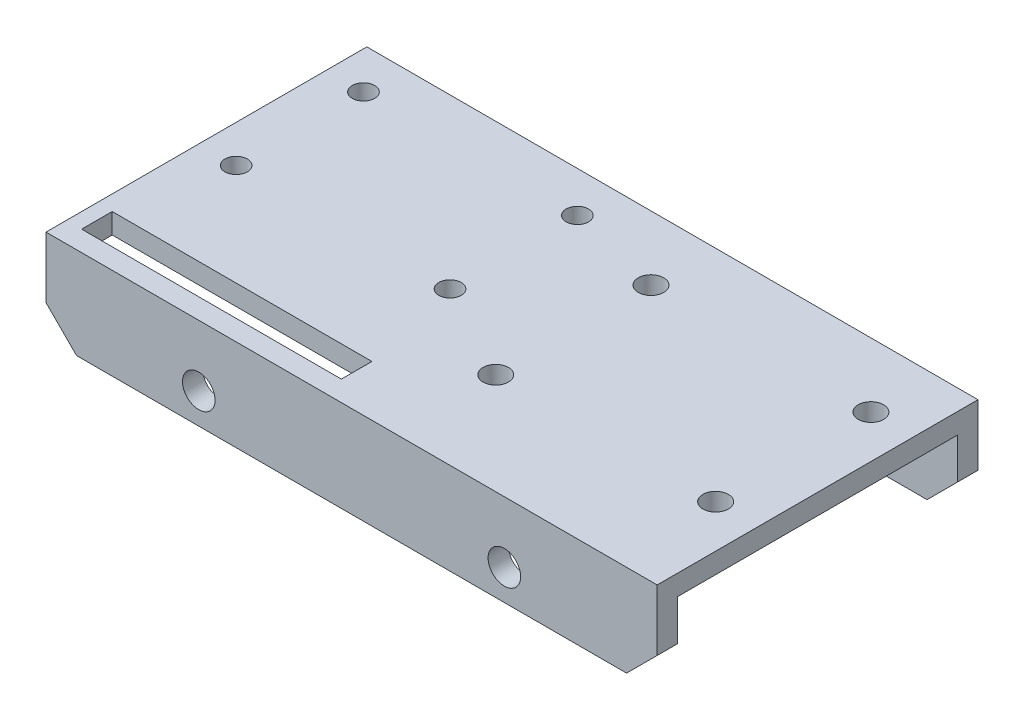
ISO-10303-21;
HEADER;
FILE_DESCRIPTION(('STEP AP214'),'2;1');
FILE_NAME('part.step','',(''),(''),'','','');
FILE_SCHEMA(('AUTOMOTIVE_DESIGN { 1 0 10303 214 1 1 1 1 }'));
ENDSEC;
DATA;
#1=APPLICATION_CONTEXT('core data for automotive mechanical design processes');
#2=APPLICATION_PROTOCOL_DEFINITION('international standard','automotive_design',2000,#1);
#3=PRODUCT_CONTEXT('',#1,'mechanical');
#4=PRODUCT('Part','Part','',(#3));
#5=PRODUCT_RELATED_PRODUCT_CATEGORY('part','',(#4));
#6=PRODUCT_DEFINITION_FORMATION('','',#4);
#7=PRODUCT_DEFINITION_CONTEXT('part definition',#1,'design');
#8=PRODUCT_DEFINITION('design','',#6,#7);
#9=PRODUCT_DEFINITION_SHAPE('','',#8);
#10=(LENGTH_UNIT() NAMED_UNIT(*) SI_UNIT(.MILLI.,.METRE.));
#11=(NAMED_UNIT(*) PLANE_ANGLE_UNIT() SI_UNIT($,.RADIAN.));
#12=(NAMED_UNIT(*) SI_UNIT($,.STERADIAN.) SOLID_ANGLE_UNIT());
#13=UNCERTAINTY_MEASURE_WITH_UNIT(LENGTH_MEASURE(1.E-05),#10,'distance_accuracy_value','');
#14=(GEOMETRIC_REPRESENTATION_CONTEXT(3) GLOBAL_UNCERTAINTY_ASSIGNED_CONTEXT((#13)) GLOBAL_UNIT_ASSIGNED_CONTEXT((#10,
#11,#12)) REPRESENTATION_CONTEXT('',''));
#15=CARTESIAN_POINT('',(0.,0.,0.));
#16=DIRECTION('',(0.,0.,1.));
#17=DIRECTION('',(1.,0.,0.));
#18=AXIS2_PLACEMENT_3D('',#15,#16,#17);
#19=CARTESIAN_POINT('',(0.,0.,0.));
#20=DIRECTION('',(0.,1.,0.));
#21=DIRECTION('',(0.,0.,1.));
#22=AXIS2_PLACEMENT_3D('',#19,#20,#21);
#23=PLANE('',#22);
#24=CARTESIAN_POINT('',(-26.335,0.,0.750000000000007));
#25=DIRECTION('',(0.,1.,0.));
#26=DIRECTION('',(0.,0.,1.));
#27=AXIS2_PLACEMENT_3D('',#24,#25,#26);
#28=CIRCLE('',#27,1.1);
#29=CARTESIAN_POINT('',(-26.335,0.,1.85000000000001));
#30=VERTEX_POINT('',#29);
#31=EDGE_CURVE('E216',#30,#30,#28,.T.);
#32=ORIENTED_EDGE('',*,*,#31,.T.);
#33=EDGE_LOOP('',(#32));
#34=FACE_BOUND('',#33,.T.);
#35=CARTESIAN_POINT('',(4.20500000000002,0.,-9.43900000000005));
#36=DIRECTION('',(0.,1.,0.));
#37=DIRECTION('',(0.,0.,1.));
#38=AXIS2_PLACEMENT_3D('',#35,#36,#37);
#39=CIRCLE('',#38,1.25);
#40=CARTESIAN_POINT('',(4.20500000000002,0.,-8.18900000000005));
#41=VERTEX_POINT('',#40);
#42=EDGE_CURVE('E213',#41,#41,#39,.T.);
#43=ORIENTED_EDGE('',*,*,#42,.T.);
#44=EDGE_LOOP('',(#43));
#45=FACE_BOUND('',#44,.T.);
#46=CARTESIAN_POINT('',(25.795,0.,-9.43900000000004));
#47=DIRECTION('',(0.,1.,0.));
#48=DIRECTION('',(0.,0.,1.));
#49=AXIS2_PLACEMENT_3D('',#46,#47,#48);
#50=CIRCLE('',#49,1.25);
#51=CARTESIAN_POINT('',(25.795,0.,-8.18900000000004));
#52=VERTEX_POINT('',#51);
#53=EDGE_CURVE('E210',#52,#52,#50,.T.);
#54=ORIENTED_EDGE('',*,*,#53,.T.);
#55=EDGE_LOOP('',(#54));
#56=FACE_BOUND('',#55,.T.);
#57=CARTESIAN_POINT('',(4.20500000000002,0.,5.80099999999995));
#58=DIRECTION('',(0.,1.,0.));
#59=DIRECTION('',(0.,0.,1.));
#60=AXIS2_PLACEMENT_3D('',#57,#58,#59);
#61=CIRCLE('',#60,1.25);
#62=CARTESIAN_POINT('',(4.20500000000002,0.,7.05099999999995));
#63=VERTEX_POINT('',#62);
#64=EDGE_CURVE('E207',#63,#63,#61,.T.);
#65=ORIENTED_EDGE('',*,*,#64,.T.);
#66=EDGE_LOOP('',(#65));
#67=FACE_BOUND('',#66,.T.);
#68=CARTESIAN_POINT('',(-5.33499999999998,0.,-11.75));
#69=DIRECTION('',(0.,1.,0.));
#70=DIRECTION('',(0.,0.,1.));
#71=AXIS2_PLACEMENT_3D('',#68,#69,#70);
#72=CIRCLE('',#71,1.1);
#73=CARTESIAN_POINT('',(-5.33499999999998,0.,-10.65));
#74=VERTEX_POINT('',#73);
#75=EDGE_CURVE('E204',#74,#74,#72,.T.);
#76=ORIENTED_EDGE('',*,*,#75,.T.);
#77=EDGE_LOOP('',(#76));
#78=FACE_BOUND('',#77,.T.);
#79=CARTESIAN_POINT('',(-5.33499999999998,0.,0.750000000000016));
#80=DIRECTION('',(0.,1.,0.));
#81=DIRECTION('',(0.,0.,1.));
#82=AXIS2_PLACEMENT_3D('',#79,#80,#81);
#83=CIRCLE('',#82,1.1);
#84=CARTESIAN_POINT('',(-5.33499999999998,0.,1.85000000000002));
#85=VERTEX_POINT('',#84);
#86=EDGE_CURVE('E201',#85,#85,#83,.T.);
#87=ORIENTED_EDGE('',*,*,#86,.T.);
#88=EDGE_LOOP('',(#87));
#89=FACE_BOUND('',#88,.T.);
#90=CARTESIAN_POINT('',(-26.335,0.,-11.75));
#91=DIRECTION('',(0.,1.,0.));
#92=DIRECTION('',(0.,0.,1.));
#93=AXIS2_PLACEMENT_3D('',#90,#91,#92);
#94=CIRCLE('',#93,1.1);
#95=CARTESIAN_POINT('',(-26.335,0.,-10.65));
#96=VERTEX_POINT('',#95);
#97=EDGE_CURVE('E198',#96,#96,#94,.T.);
#98=ORIENTED_EDGE('',*,*,#97,.T.);
#99=EDGE_LOOP('',(#98));
#100=FACE_BOUND('',#99,.T.);
#101=CARTESIAN_POINT('',(25.795,0.,5.80099999999996));
#102=DIRECTION('',(0.,1.,0.));
#103=DIRECTION('',(0.,0.,1.));
#104=AXIS2_PLACEMENT_3D('',#101,#102,#103);
#105=CIRCLE('',#104,1.25);
#106=CARTESIAN_POINT('',(25.795,0.,7.05099999999996));
#107=VERTEX_POINT('',#106);
#108=EDGE_CURVE('E195',#107,#107,#105,.T.);
#109=ORIENTED_EDGE('',*,*,#108,.T.);
#110=EDGE_LOOP('',(#109));
#111=FACE_BOUND('',#110,.T.);
#112=DIRECTION('',(1.,0.,0.));
#113=VECTOR('',#112,1.);
#114=CARTESIAN_POINT('',(-28.5,0.,10.75));
#115=LINE('',#114,#113);
#116=CARTESIAN_POINT('',(-28.5,0.,10.75));
#117=VERTEX_POINT('',#116);
#118=CARTESIAN_POINT('',(-3.,0.,10.75));
#119=VERTEX_POINT('',#118);
#120=EDGE_CURVE('E148',#117,#119,#115,.T.);
#121=ORIENTED_EDGE('',*,*,#120,.F.);
#122=DIRECTION('',(0.,0.,-1.));
#123=VECTOR('',#122,1.);
#124=CARTESIAN_POINT('',(-28.5,0.,13.75));
#125=LINE('',#124,#123);
#126=CARTESIAN_POINT('',(-28.5,0.,13.75));
#127=VERTEX_POINT('',#126);
#128=EDGE_CURVE('E155',#127,#117,#125,.T.);
#129=ORIENTED_EDGE('',*,*,#128,.F.);
#130=DIRECTION('',(1.,0.,0.));
#131=VECTOR('',#130,1.);
#132=CARTESIAN_POINT('',(30.,0.,13.75));
#133=LINE('',#132,#131);
#134=CARTESIAN_POINT('',(-30.,0.,13.75));
#135=VERTEX_POINT('',#134);
#136=EDGE_CURVE('E244',#135,#127,#133,.T.);
#137=ORIENTED_EDGE('',*,*,#136,.F.);
#138=DIRECTION('',(0.,0.,1.));
#139=VECTOR('',#138,1.);
#140=CARTESIAN_POINT('',(-30.,0.,-15.75));
#141=LINE('',#140,#139);
#142=CARTESIAN_POINT('',(-30.,0.,-13.75));
#143=VERTEX_POINT('',#142);
#144=EDGE_CURVE('E271',#143,#135,#141,.T.);
#145=ORIENTED_EDGE('',*,*,#144,.F.);
#146=DIRECTION('',(-1.,0.,0.));
#147=VECTOR('',#146,1.);
#148=CARTESIAN_POINT('',(30.,0.,-13.75));
#149=LINE('',#148,#147);
#150=CARTESIAN_POINT('',(30.,0.,-13.75));
#151=VERTEX_POINT('',#150);
#152=EDGE_CURVE('E253',#151,#143,#149,.T.);
#153=ORIENTED_EDGE('',*,*,#152,.F.);
#154=DIRECTION('',(0.,0.,-1.));
#155=VECTOR('',#154,1.);
#156=CARTESIAN_POINT('',(30.,0.,-15.75));
#157=LINE('',#156,#155);
#158=CARTESIAN_POINT('',(30.,0.,13.75));
#159=VERTEX_POINT('',#158);
#160=EDGE_CURVE('E266',#159,#151,#157,.T.);
#161=ORIENTED_EDGE('',*,*,#160,.F.);
#162=CARTESIAN_POINT('',(-3.,0.,13.75));
#163=VERTEX_POINT('',#162);
#164=EDGE_CURVE('E239',#163,#159,#133,.T.);
#165=ORIENTED_EDGE('',*,*,#164,.F.);
#166=DIRECTION('',(0.,0.,1.));
#167=VECTOR('',#166,1.);
#168=CARTESIAN_POINT('',(-3.,0.,13.75));
#169=LINE('',#168,#167);
#170=EDGE_CURVE('E55',#119,#163,#169,.T.);
#171=ORIENTED_EDGE('',*,*,#170,.F.);
#172=EDGE_LOOP('',(#121,#129,#137,#145,#153,#161,#165,#171));
#173=FACE_BOUND('',#172,.T.);
#174=ADVANCED_FACE('F33',(#34,#45,#56,#67,#78,#89,#100,#111,#173),#23,.F.);
#175=CARTESIAN_POINT('',(30.,2.,-15.75));
#176=DIRECTION('',(-1.,0.,0.));
#177=DIRECTION('',(0.,0.,1.));
#178=AXIS2_PLACEMENT_3D('',#175,#176,#177);
#179=PLANE('',#178);
#180=DIRECTION('',(0.,-1.,0.));
#181=VECTOR('',#180,1.);
#182=CARTESIAN_POINT('',(30.,2.,15.75));
#183=LINE('',#182,#181);
#184=CARTESIAN_POINT('',(30.,2.,15.75));
#185=VERTEX_POINT('',#184);
#186=CARTESIAN_POINT('',(30.,-3.99999999999998,15.75));
#187=VERTEX_POINT('',#186);
#188=EDGE_CURVE('E277',#185,#187,#183,.T.);
#189=ORIENTED_EDGE('',*,*,#188,.T.);
#190=DIRECTION('',(0.,0.,-1.));
#191=VECTOR('',#190,1.);
#192=CARTESIAN_POINT('',(30.,-3.99999999999998,-15.75));
#193=LINE('',#192,#191);
#194=CARTESIAN_POINT('',(30.,-3.99999999999998,13.75));
#195=VERTEX_POINT('',#194);
#196=EDGE_CURVE('E325',#187,#195,#193,.T.);
#197=ORIENTED_EDGE('',*,*,#196,.T.);
#198=DIRECTION('',(0.,1.,0.));
#199=VECTOR('',#198,1.);
#200=CARTESIAN_POINT('',(30.,-7.,13.75));
#201=LINE('',#200,#199);
#202=EDGE_CURVE('E247',#195,#159,#201,.T.);
#203=ORIENTED_EDGE('',*,*,#202,.T.);
#204=ORIENTED_EDGE('',*,*,#160,.T.);
#205=DIRECTION('',(0.,1.,0.));
#206=VECTOR('',#205,1.);
#207=CARTESIAN_POINT('',(30.,-7.,-13.75));
#208=LINE('',#207,#206);
#209=CARTESIAN_POINT('',(30.,-4.,-13.75));
#210=VERTEX_POINT('',#209);
#211=EDGE_CURVE('E264',#210,#151,#208,.T.);
#212=ORIENTED_EDGE('',*,*,#211,.F.);
#213=DIRECTION('',(0.,0.,-1.));
#214=VECTOR('',#213,1.);
#215=CARTESIAN_POINT('',(30.,-4.,-15.75));
#216=LINE('',#215,#214);
#217=CARTESIAN_POINT('',(30.,-4.,-15.75));
#218=VERTEX_POINT('',#217);
#219=EDGE_CURVE('E313',#210,#218,#216,.T.);
#220=ORIENTED_EDGE('',*,*,#219,.T.);
#221=DIRECTION('',(0.,-1.,0.));
#222=VECTOR('',#221,1.);
#223=CARTESIAN_POINT('',(30.,2.,-15.75));
#224=LINE('',#223,#222);
#225=CARTESIAN_POINT('',(30.,2.,-15.75));
#226=VERTEX_POINT('',#225);
#227=EDGE_CURVE('E290',#226,#218,#224,.T.);
#228=ORIENTED_EDGE('',*,*,#227,.F.);
#229=DIRECTION('',(0.,0.,-1.));
#230=VECTOR('',#229,1.);
#231=CARTESIAN_POINT('',(30.,2.,-15.75));
#232=LINE('',#231,#230);
#233=EDGE_CURVE('E267',#185,#226,#232,.T.);
#234=ORIENTED_EDGE('',*,*,#233,.F.);
#235=EDGE_LOOP('',(#189,#197,#203,#204,#212,#220,#228,#234));
#236=FACE_BOUND('',#235,.T.);
#237=ADVANCED_FACE('F370',(#236),#179,.F.);
#238=CARTESIAN_POINT('',(-30.,2.,-15.75));
#239=DIRECTION('',(0.,0.,1.));
#240=DIRECTION('',(1.,0.,0.));
#241=AXIS2_PLACEMENT_3D('',#238,#239,#240);
#242=PLANE('',#241);
#243=CARTESIAN_POINT('',(-15.,-3.99999999999999,-15.75));
#244=DIRECTION('',(0.,0.,1.));
#245=DIRECTION('',(1.,0.,0.));
#246=AXIS2_PLACEMENT_3D('',#243,#244,#245);
#247=CIRCLE('',#246,1.60000000000001);
#248=CARTESIAN_POINT('',(-13.4,-3.99999999999999,-15.75));
#249=VERTEX_POINT('',#248);
#250=EDGE_CURVE('E236',#249,#249,#247,.T.);
#251=ORIENTED_EDGE('',*,*,#250,.T.);
#252=EDGE_LOOP('',(#251));
#253=FACE_BOUND('',#252,.T.);
#254=CARTESIAN_POINT('',(15.,-3.99999999999999,-15.75));
#255=DIRECTION('',(0.,0.,1.));
#256=DIRECTION('',(1.,0.,0.));
#257=AXIS2_PLACEMENT_3D('',#254,#255,#256);
#258=CIRCLE('',#257,1.6);
#259=CARTESIAN_POINT('',(16.6,-3.99999999999999,-15.75));
#260=VERTEX_POINT('',#259);
#261=EDGE_CURVE('E229',#260,#260,#258,.T.);
#262=ORIENTED_EDGE('',*,*,#261,.T.);
#263=EDGE_LOOP('',(#262));
#264=FACE_BOUND('',#263,.T.);
#265=DIRECTION('',(1.,0.,0.));
#266=VECTOR('',#265,1.);
#267=CARTESIAN_POINT('',(30.,-7.,-15.75));
#268=LINE('',#267,#266);
#269=CARTESIAN_POINT('',(-27.,-7.,-15.75));
#270=VERTEX_POINT('',#269);
#271=CARTESIAN_POINT('',(27.,-7.,-15.75));
#272=VERTEX_POINT('',#271);
#273=EDGE_CURVE('E257',#270,#272,#268,.T.);
#274=ORIENTED_EDGE('',*,*,#273,.F.);
#275=DIRECTION('',(-0.707106781186547,0.707106781186549,0.));
#276=VECTOR('',#275,1.);
#277=CARTESIAN_POINT('',(-27.,-7.,-15.75));
#278=LINE('',#277,#276);
#279=CARTESIAN_POINT('',(-30.,-4.,-15.75));
#280=VERTEX_POINT('',#279);
#281=EDGE_CURVE('E305',#270,#280,#278,.T.);
#282=ORIENTED_EDGE('',*,*,#281,.T.);
#283=DIRECTION('',(0.,-1.,0.));
#284=VECTOR('',#283,1.);
#285=CARTESIAN_POINT('',(-30.,2.,-15.75));
#286=LINE('',#285,#284);
#287=CARTESIAN_POINT('',(-30.,2.,-15.75));
#288=VERTEX_POINT('',#287);
#289=EDGE_CURVE('E287',#288,#280,#286,.T.);
#290=ORIENTED_EDGE('',*,*,#289,.F.);
#291=DIRECTION('',(-1.,0.,0.));
#292=VECTOR('',#291,1.);
#293=CARTESIAN_POINT('',(-30.,2.,-15.75));
#294=LINE('',#293,#292);
#295=EDGE_CURVE('E270',#226,#288,#294,.T.);
#296=ORIENTED_EDGE('',*,*,#295,.F.);
#297=ORIENTED_EDGE('',*,*,#227,.T.);
#298=DIRECTION('',(-0.707106781186547,-0.707106781186548,0.));
#299=VECTOR('',#298,1.);
#300=CARTESIAN_POINT('',(27.,-7.,-15.75));
#301=LINE('',#300,#299);
#302=EDGE_CURVE('E303',#218,#272,#301,.T.);
#303=ORIENTED_EDGE('',*,*,#302,.T.);
#304=EDGE_LOOP('',(#274,#282,#290,#296,#297,#303));
#305=FACE_BOUND('',#304,.T.);
#306=ADVANCED_FACE('F376',(#253,#264,#305),#242,.F.);
#307=CARTESIAN_POINT('',(-30.,2.,-15.75));
#308=DIRECTION('',(1.,0.,0.));
#309=DIRECTION('',(0.,0.,-1.));
#310=AXIS2_PLACEMENT_3D('',#307,#308,#309);
#311=PLANE('',#310);
#312=DIRECTION('',(0.,1.,0.));
#313=VECTOR('',#312,1.);
#314=CARTESIAN_POINT('',(-30.,-7.,13.75));
#315=LINE('',#314,#313);
#316=CARTESIAN_POINT('',(-30.,-4.,13.75));
#317=VERTEX_POINT('',#316);
#318=EDGE_CURVE('E251',#317,#135,#315,.T.);
#319=ORIENTED_EDGE('',*,*,#318,.F.);
#320=DIRECTION('',(0.,0.,1.));
#321=VECTOR('',#320,1.);
#322=CARTESIAN_POINT('',(-30.,-4.,-15.75));
#323=LINE('',#322,#321);
#324=CARTESIAN_POINT('',(-30.,-4.,15.75));
#325=VERTEX_POINT('',#324);
#326=EDGE_CURVE('E331',#317,#325,#323,.T.);
#327=ORIENTED_EDGE('',*,*,#326,.T.);
#328=DIRECTION('',(0.,-1.,0.));
#329=VECTOR('',#328,1.);
#330=CARTESIAN_POINT('',(-30.,2.,15.75));
#331=LINE('',#330,#329);
#332=CARTESIAN_POINT('',(-30.,2.,15.75));
#333=VERTEX_POINT('',#332);
#334=EDGE_CURVE('E284',#333,#325,#331,.T.);
#335=ORIENTED_EDGE('',*,*,#334,.F.);
#336=DIRECTION('',(0.,0.,1.));
#337=VECTOR('',#336,1.);
#338=CARTESIAN_POINT('',(-30.,2.,-15.75));
#339=LINE('',#338,#337);
#340=EDGE_CURVE('E273',#288,#333,#339,.T.);
#341=ORIENTED_EDGE('',*,*,#340,.F.);
#342=ORIENTED_EDGE('',*,*,#289,.T.);
#343=DIRECTION('',(0.,0.,1.));
#344=VECTOR('',#343,1.);
#345=CARTESIAN_POINT('',(-30.,-4.,-13.75));
#346=LINE('',#345,#344);
#347=CARTESIAN_POINT('',(-30.,-4.,-13.75));
#348=VERTEX_POINT('',#347);
#349=EDGE_CURVE('E307',#280,#348,#346,.T.);
#350=ORIENTED_EDGE('',*,*,#349,.T.);
#351=DIRECTION('',(0.,1.,0.));
#352=VECTOR('',#351,1.);
#353=CARTESIAN_POINT('',(-30.,-7.,-13.75));
#354=LINE('',#353,#352);
#355=EDGE_CURVE('E260',#348,#143,#354,.T.);
#356=ORIENTED_EDGE('',*,*,#355,.T.);
#357=ORIENTED_EDGE('',*,*,#144,.T.);
#358=EDGE_LOOP('',(#319,#327,#335,#341,#342,#350,#356,#357));
#359=FACE_BOUND('',#358,.T.);
#360=ADVANCED_FACE('F393',(#359),#311,.F.);
#361=CARTESIAN_POINT('',(-30.,2.,15.75));
#362=DIRECTION('',(0.,0.,-1.));
#363=DIRECTION('',(-1.,0.,0.));
#364=AXIS2_PLACEMENT_3D('',#361,#362,#363);
#365=PLANE('',#364);
#366=CARTESIAN_POINT('',(-15.,-3.99999999999999,15.75));
#367=DIRECTION('',(0.,0.,-1.));
#368=DIRECTION('',(-1.,0.,0.));
#369=AXIS2_PLACEMENT_3D('',#366,#367,#368);
#370=CIRCLE('',#369,1.60000000000001);
#371=CARTESIAN_POINT('',(-16.6,-3.99999999999999,15.75));
#372=VERTEX_POINT('',#371);
#373=EDGE_CURVE('E220',#372,#372,#370,.T.);
#374=ORIENTED_EDGE('',*,*,#373,.T.);
#375=EDGE_LOOP('',(#374));
#376=FACE_BOUND('',#375,.T.);
#377=CARTESIAN_POINT('',(15.,-3.99999999999999,15.75));
#378=DIRECTION('',(0.,0.,-1.));
#379=DIRECTION('',(1.,0.,0.));
#380=AXIS2_PLACEMENT_3D('',#377,#378,#379);
#381=CIRCLE('',#380,1.6);
#382=CARTESIAN_POINT('',(16.6,-3.99999999999999,15.75));
#383=VERTEX_POINT('',#382);
#384=EDGE_CURVE('E219',#383,#383,#381,.T.);
#385=ORIENTED_EDGE('',*,*,#384,.T.);
#386=EDGE_LOOP('',(#385));
#387=FACE_BOUND('',#386,.T.);
#388=DIRECTION('',(-1.,0.,0.));
#389=VECTOR('',#388,1.);
#390=CARTESIAN_POINT('',(30.,-7.,15.75));
#391=LINE('',#390,#389);
#392=CARTESIAN_POINT('',(27.,-7.,15.75));
#393=VERTEX_POINT('',#392);
#394=CARTESIAN_POINT('',(-27.,-7.,15.75));
#395=VERTEX_POINT('',#394);
#396=EDGE_CURVE('E240',#393,#395,#391,.T.);
#397=ORIENTED_EDGE('',*,*,#396,.F.);
#398=DIRECTION('',(-0.707106781186547,-0.707106781186548,0.));
#399=VECTOR('',#398,1.);
#400=CARTESIAN_POINT('',(27.,-7.,15.75));
#401=LINE('',#400,#399);
#402=EDGE_CURVE('E323',#393,#187,#401,.F.);
#403=ORIENTED_EDGE('',*,*,#402,.T.);
#404=ORIENTED_EDGE('',*,*,#188,.F.);
#405=DIRECTION('',(1.,0.,0.));
#406=VECTOR('',#405,1.);
#407=CARTESIAN_POINT('',(-30.,2.,15.75));
#408=LINE('',#407,#406);
#409=EDGE_CURVE('E275',#333,#185,#408,.T.);
#410=ORIENTED_EDGE('',*,*,#409,.F.);
#411=ORIENTED_EDGE('',*,*,#334,.T.);
#412=DIRECTION('',(-0.707106781186547,0.707106781186549,0.));
#413=VECTOR('',#412,1.);
#414=CARTESIAN_POINT('',(-27.,-7.,15.75));
#415=LINE('',#414,#413);
#416=EDGE_CURVE('E321',#325,#395,#415,.F.);
#417=ORIENTED_EDGE('',*,*,#416,.T.);
#418=EDGE_LOOP('',(#397,#403,#404,#410,#411,#417));
#419=FACE_BOUND('',#418,.T.);
#420=ADVANCED_FACE('F346',(#376,#387,#419),#365,.F.);
#421=CARTESIAN_POINT('',(0.,2.,0.));
#422=DIRECTION('',(0.,1.,0.));
#423=DIRECTION('',(0.,0.,1.));
#424=AXIS2_PLACEMENT_3D('',#421,#422,#423);
#425=PLANE('',#424);
#426=DIRECTION('',(0.,0.,1.));
#427=VECTOR('',#426,1.);
#428=CARTESIAN_POINT('',(-28.5,2.,0.));
#429=LINE('',#428,#427);
#430=CARTESIAN_POINT('',(-28.5,2.,10.75));
#431=VERTEX_POINT('',#430);
#432=CARTESIAN_POINT('',(-28.5,2.,13.75));
#433=VERTEX_POINT('',#432);
#434=EDGE_CURVE('E11',#431,#433,#429,.T.);
#435=ORIENTED_EDGE('',*,*,#434,.F.);
#436=DIRECTION('',(-1.,0.,0.));
#437=VECTOR('',#436,1.);
#438=CARTESIAN_POINT('',(0.,2.,10.75));
#439=LINE('',#438,#437);
#440=CARTESIAN_POINT('',(-3.,2.,10.75));
#441=VERTEX_POINT('',#440);
#442=EDGE_CURVE('E150',#441,#431,#439,.T.);
#443=ORIENTED_EDGE('',*,*,#442,.F.);
#444=DIRECTION('',(0.,0.,-1.));
#445=VECTOR('',#444,1.);
#446=CARTESIAN_POINT('',(-3.,2.,0.));
#447=LINE('',#446,#445);
#448=CARTESIAN_POINT('',(-3.,2.,13.75));
#449=VERTEX_POINT('',#448);
#450=EDGE_CURVE('E334',#449,#441,#447,.T.);
#451=ORIENTED_EDGE('',*,*,#450,.F.);
#452=DIRECTION('',(1.,0.,0.));
#453=VECTOR('',#452,1.);
#454=CARTESIAN_POINT('',(0.,2.,13.75));
#455=LINE('',#454,#453);
#456=EDGE_CURVE('E41',#433,#449,#455,.T.);
#457=ORIENTED_EDGE('',*,*,#456,.F.);
#458=EDGE_LOOP('',(#435,#443,#451,#457));
#459=FACE_BOUND('',#458,.T.);
#460=CARTESIAN_POINT('',(-26.335,2.,0.750000000000007));
#461=DIRECTION('',(0.,1.,0.));
#462=DIRECTION('',(0.,0.,1.));
#463=AXIS2_PLACEMENT_3D('',#460,#461,#462);
#464=CIRCLE('',#463,1.1);
#465=CARTESIAN_POINT('',(-26.335,2.,1.85000000000001));
#466=VERTEX_POINT('',#465);
#467=EDGE_CURVE('E178',#466,#466,#464,.T.);
#468=ORIENTED_EDGE('',*,*,#467,.F.);
#469=EDGE_LOOP('',(#468));
#470=FACE_BOUND('',#469,.T.);
#471=CARTESIAN_POINT('',(4.20500000000002,2.,-9.43900000000005));
#472=DIRECTION('',(0.,1.,0.));
#473=DIRECTION('',(0.,0.,1.));
#474=AXIS2_PLACEMENT_3D('',#471,#472,#473);
#475=CIRCLE('',#474,1.25);
#476=CARTESIAN_POINT('',(4.20500000000002,2.,-8.18900000000005));
#477=VERTEX_POINT('',#476);
#478=EDGE_CURVE('E181',#477,#477,#475,.T.);
#479=ORIENTED_EDGE('',*,*,#478,.F.);
#480=EDGE_LOOP('',(#479));
#481=FACE_BOUND('',#480,.T.);
#482=CARTESIAN_POINT('',(25.795,2.,-9.43900000000004));
#483=DIRECTION('',(0.,1.,0.));
#484=DIRECTION('',(0.,0.,1.));
#485=AXIS2_PLACEMENT_3D('',#482,#483,#484);
#486=CIRCLE('',#485,1.25);
#487=CARTESIAN_POINT('',(25.795,2.,-8.18900000000004));
#488=VERTEX_POINT('',#487);
#489=EDGE_CURVE('E184',#488,#488,#486,.T.);
#490=ORIENTED_EDGE('',*,*,#489,.F.);
#491=EDGE_LOOP('',(#490));
#492=FACE_BOUND('',#491,.T.);
#493=CARTESIAN_POINT('',(4.20500000000002,2.,5.80099999999995));
#494=DIRECTION('',(0.,1.,0.));
#495=DIRECTION('',(0.,0.,1.));
#496=AXIS2_PLACEMENT_3D('',#493,#494,#495);
#497=CIRCLE('',#496,1.25);
#498=CARTESIAN_POINT('',(4.20500000000002,2.,7.05099999999995));
#499=VERTEX_POINT('',#498);
#500=EDGE_CURVE('E187',#499,#499,#497,.T.);
#501=ORIENTED_EDGE('',*,*,#500,.F.);
#502=EDGE_LOOP('',(#501));
#503=FACE_BOUND('',#502,.T.);
#504=CARTESIAN_POINT('',(-5.33499999999998,2.,-11.75));
#505=DIRECTION('',(0.,1.,0.));
#506=DIRECTION('',(0.,0.,1.));
#507=AXIS2_PLACEMENT_3D('',#504,#505,#506);
#508=CIRCLE('',#507,1.1);
#509=CARTESIAN_POINT('',(-5.33499999999998,2.,-10.65));
#510=VERTEX_POINT('',#509);
#511=EDGE_CURVE('E168',#510,#510,#508,.T.);
#512=ORIENTED_EDGE('',*,*,#511,.F.);
#513=EDGE_LOOP('',(#512));
#514=FACE_BOUND('',#513,.T.);
#515=CARTESIAN_POINT('',(-5.33499999999998,2.,0.750000000000016));
#516=DIRECTION('',(0.,1.,0.));
#517=DIRECTION('',(0.,0.,1.));
#518=AXIS2_PLACEMENT_3D('',#515,#516,#517);
#519=CIRCLE('',#518,1.1);
#520=CARTESIAN_POINT('',(-5.33499999999998,2.,1.85000000000002));
#521=VERTEX_POINT('',#520);
#522=EDGE_CURVE('E174',#521,#521,#519,.T.);
#523=ORIENTED_EDGE('',*,*,#522,.F.);
#524=EDGE_LOOP('',(#523));
#525=FACE_BOUND('',#524,.T.);
#526=CARTESIAN_POINT('',(-26.335,2.,-11.75));
#527=DIRECTION('',(0.,1.,0.));
#528=DIRECTION('',(0.,0.,1.));
#529=AXIS2_PLACEMENT_3D('',#526,#527,#528);
#530=CIRCLE('',#529,1.1);
#531=CARTESIAN_POINT('',(-26.335,2.,-10.65));
#532=VERTEX_POINT('',#531);
#533=EDGE_CURVE('E175',#532,#532,#530,.T.);
#534=ORIENTED_EDGE('',*,*,#533,.F.);
#535=EDGE_LOOP('',(#534));
#536=FACE_BOUND('',#535,.T.);
#537=CARTESIAN_POINT('',(25.795,2.,5.80099999999996));
#538=DIRECTION('',(0.,1.,0.));
#539=DIRECTION('',(0.,0.,1.));
#540=AXIS2_PLACEMENT_3D('',#537,#538,#539);
#541=CIRCLE('',#540,1.25);
#542=CARTESIAN_POINT('',(25.795,2.,7.05099999999996));
#543=VERTEX_POINT('',#542);
#544=EDGE_CURVE('E190',#543,#543,#541,.T.);
#545=ORIENTED_EDGE('',*,*,#544,.F.);
#546=EDGE_LOOP('',(#545));
#547=FACE_BOUND('',#546,.T.);
#548=ORIENTED_EDGE('',*,*,#233,.T.);
#549=ORIENTED_EDGE('',*,*,#295,.T.);
#550=ORIENTED_EDGE('',*,*,#340,.T.);
#551=ORIENTED_EDGE('',*,*,#409,.T.);
#552=EDGE_LOOP('',(#548,#549,#550,#551));
#553=FACE_BOUND('',#552,.T.);
#554=ADVANCED_FACE('F342',(#459,#470,#481,#492,#503,#514,#525,#536,#547,#553),#425,.T.);
#555=CARTESIAN_POINT('',(30.,-7.,-13.75));
#556=DIRECTION('',(0.,0.,-1.));
#557=DIRECTION('',(-1.,0.,0.));
#558=AXIS2_PLACEMENT_3D('',#555,#556,#557);
#559=PLANE('',#558);
#560=CARTESIAN_POINT('',(-15.,-3.99999999999999,-13.75));
#561=DIRECTION('',(0.,0.,-1.));
#562=DIRECTION('',(-1.,0.,0.));
#563=AXIS2_PLACEMENT_3D('',#560,#561,#562);
#564=CIRCLE('',#563,1.60000000000001);
#565=CARTESIAN_POINT('',(-16.6,-3.99999999999999,-13.75));
#566=VERTEX_POINT('',#565);
#567=EDGE_CURVE('E233',#566,#566,#564,.T.);
#568=ORIENTED_EDGE('',*,*,#567,.T.);
#569=EDGE_LOOP('',(#568));
#570=FACE_BOUND('',#569,.T.);
#571=CARTESIAN_POINT('',(15.,-3.99999999999999,-13.75));
#572=DIRECTION('',(0.,0.,-1.));
#573=DIRECTION('',(-1.,0.,0.));
#574=AXIS2_PLACEMENT_3D('',#571,#572,#573);
#575=CIRCLE('',#574,1.6);
#576=CARTESIAN_POINT('',(13.4,-3.99999999999999,-13.75));
#577=VERTEX_POINT('',#576);
#578=EDGE_CURVE('E226',#577,#577,#575,.T.);
#579=ORIENTED_EDGE('',*,*,#578,.T.);
#580=EDGE_LOOP('',(#579));
#581=FACE_BOUND('',#580,.T.);
#582=ORIENTED_EDGE('',*,*,#355,.F.);
#583=DIRECTION('',(0.707106781186547,-0.707106781186549,0.));
#584=VECTOR('',#583,1.);
#585=CARTESIAN_POINT('',(-27.,-7.,-13.75));
#586=LINE('',#585,#584);
#587=CARTESIAN_POINT('',(-27.,-7.,-13.75));
#588=VERTEX_POINT('',#587);
#589=EDGE_CURVE('E311',#348,#588,#586,.T.);
#590=ORIENTED_EDGE('',*,*,#589,.T.);
#591=DIRECTION('',(-1.,0.,0.));
#592=VECTOR('',#591,1.);
#593=CARTESIAN_POINT('',(30.,-7.,-13.75));
#594=LINE('',#593,#592);
#595=CARTESIAN_POINT('',(27.,-7.,-13.75));
#596=VERTEX_POINT('',#595);
#597=EDGE_CURVE('E254',#596,#588,#594,.T.);
#598=ORIENTED_EDGE('',*,*,#597,.F.);
#599=DIRECTION('',(0.707106781186547,0.707106781186548,0.));
#600=VECTOR('',#599,1.);
#601=CARTESIAN_POINT('',(27.,-7.,-13.75));
#602=LINE('',#601,#600);
#603=EDGE_CURVE('E309',#596,#210,#602,.T.);
#604=ORIENTED_EDGE('',*,*,#603,.T.);
#605=ORIENTED_EDGE('',*,*,#211,.T.);
#606=ORIENTED_EDGE('',*,*,#152,.T.);
#607=EDGE_LOOP('',(#582,#590,#598,#604,#605,#606));
#608=FACE_BOUND('',#607,.T.);
#609=ADVANCED_FACE('F345',(#570,#581,#608),#559,.F.);
#610=CARTESIAN_POINT('',(0.,-7.,0.));
#611=DIRECTION('',(0.,-1.,0.));
#612=DIRECTION('',(0.,0.,-1.));
#613=AXIS2_PLACEMENT_3D('',#610,#611,#612);
#614=PLANE('',#613);
#615=ORIENTED_EDGE('',*,*,#597,.T.);
#616=DIRECTION('',(0.,0.,-1.));
#617=VECTOR('',#616,1.);
#618=CARTESIAN_POINT('',(-27.,-7.,-15.75));
#619=LINE('',#618,#617);
#620=EDGE_CURVE('E300',#588,#270,#619,.T.);
#621=ORIENTED_EDGE('',*,*,#620,.T.);
#622=ORIENTED_EDGE('',*,*,#273,.T.);
#623=DIRECTION('',(0.,0.,1.));
#624=VECTOR('',#623,1.);
#625=CARTESIAN_POINT('',(27.,-7.,-13.75));
#626=LINE('',#625,#624);
#627=EDGE_CURVE('E293',#272,#596,#626,.T.);
#628=ORIENTED_EDGE('',*,*,#627,.T.);
#629=EDGE_LOOP('',(#615,#621,#622,#628));
#630=FACE_BOUND('',#629,.T.);
#631=ADVANCED_FACE('F382',(#630),#614,.T.);
#632=CARTESIAN_POINT('',(30.,-7.,13.75));
#633=DIRECTION('',(0.,0.,1.));
#634=DIRECTION('',(1.,0.,0.));
#635=AXIS2_PLACEMENT_3D('',#632,#633,#634);
#636=PLANE('',#635);
#637=CARTESIAN_POINT('',(-15.,-3.99999999999999,13.75));
#638=DIRECTION('',(0.,0.,1.));
#639=DIRECTION('',(1.,0.,0.));
#640=AXIS2_PLACEMENT_3D('',#637,#638,#639);
#641=CIRCLE('',#640,1.60000000000001);
#642=CARTESIAN_POINT('',(-13.4,-3.99999999999999,13.75));
#643=VERTEX_POINT('',#642);
#644=EDGE_CURVE('E232',#643,#643,#641,.T.);
#645=ORIENTED_EDGE('',*,*,#644,.T.);
#646=EDGE_LOOP('',(#645));
#647=FACE_BOUND('',#646,.T.);
#648=CARTESIAN_POINT('',(15.,-3.99999999999999,13.75));
#649=DIRECTION('',(0.,0.,1.));
#650=DIRECTION('',(1.,0.,0.));
#651=AXIS2_PLACEMENT_3D('',#648,#649,#650);
#652=CIRCLE('',#651,1.6);
#653=CARTESIAN_POINT('',(16.6,-3.99999999999999,13.75));
#654=VERTEX_POINT('',#653);
#655=EDGE_CURVE('E223',#654,#654,#652,.T.);
#656=ORIENTED_EDGE('',*,*,#655,.T.);
#657=EDGE_LOOP('',(#656));
#658=FACE_BOUND('',#657,.T.);
#659=ORIENTED_EDGE('',*,*,#202,.F.);
#660=DIRECTION('',(0.707106781186547,0.707106781186548,0.));
#661=VECTOR('',#660,1.);
#662=CARTESIAN_POINT('',(27.,-7.,13.75));
#663=LINE('',#662,#661);
#664=CARTESIAN_POINT('',(27.,-7.,13.75));
#665=VERTEX_POINT('',#664);
#666=EDGE_CURVE('E329',#195,#665,#663,.F.);
#667=ORIENTED_EDGE('',*,*,#666,.T.);
#668=DIRECTION('',(1.,0.,0.));
#669=VECTOR('',#668,1.);
#670=CARTESIAN_POINT('',(30.,-7.,13.75));
#671=LINE('',#670,#669);
#672=CARTESIAN_POINT('',(-27.,-7.,13.75));
#673=VERTEX_POINT('',#672);
#674=EDGE_CURVE('E243',#673,#665,#671,.T.);
#675=ORIENTED_EDGE('',*,*,#674,.F.);
#676=DIRECTION('',(0.707106781186547,-0.707106781186549,0.));
#677=VECTOR('',#676,1.);
#678=CARTESIAN_POINT('',(-27.,-7.,13.75));
#679=LINE('',#678,#677);
#680=EDGE_CURVE('E327',#673,#317,#679,.F.);
#681=ORIENTED_EDGE('',*,*,#680,.T.);
#682=ORIENTED_EDGE('',*,*,#318,.T.);
#683=ORIENTED_EDGE('',*,*,#136,.T.);
#684=DIRECTION('',(0.,-1.,0.));
#685=VECTOR('',#684,1.);
#686=CARTESIAN_POINT('',(-28.5,10.,13.75));
#687=LINE('',#686,#685);
#688=EDGE_CURVE('E158',#433,#127,#687,.T.);
#689=ORIENTED_EDGE('',*,*,#688,.F.);
#690=ORIENTED_EDGE('',*,*,#456,.T.);
#691=DIRECTION('',(0.,-1.,0.));
#692=VECTOR('',#691,1.);
#693=CARTESIAN_POINT('',(-3.,10.,13.75));
#694=LINE('',#693,#692);
#695=EDGE_CURVE('E169',#449,#163,#694,.T.);
#696=ORIENTED_EDGE('',*,*,#695,.T.);
#697=ORIENTED_EDGE('',*,*,#164,.T.);
#698=EDGE_LOOP('',(#659,#667,#675,#681,#682,#683,#689,#690,#696,#697));
#699=FACE_BOUND('',#698,.T.);
#700=ADVANCED_FACE('F338',(#647,#658,#699),#636,.F.);
#701=CARTESIAN_POINT('',(0.,-7.,0.));
#702=DIRECTION('',(0.,1.,0.));
#703=DIRECTION('',(0.,0.,1.));
#704=AXIS2_PLACEMENT_3D('',#701,#702,#703);
#705=PLANE('',#704);
#706=ORIENTED_EDGE('',*,*,#674,.T.);
#707=DIRECTION('',(0.,0.,1.));
#708=VECTOR('',#707,1.);
#709=CARTESIAN_POINT('',(27.,-7.,0.));
#710=LINE('',#709,#708);
#711=EDGE_CURVE('E318',#665,#393,#710,.T.);
#712=ORIENTED_EDGE('',*,*,#711,.T.);
#713=ORIENTED_EDGE('',*,*,#396,.T.);
#714=DIRECTION('',(0.,0.,-1.));
#715=VECTOR('',#714,1.);
#716=CARTESIAN_POINT('',(-27.,-7.,0.));
#717=LINE('',#716,#715);
#718=EDGE_CURVE('E315',#395,#673,#717,.T.);
#719=ORIENTED_EDGE('',*,*,#718,.T.);
#720=EDGE_LOOP('',(#706,#712,#713,#719));
#721=FACE_BOUND('',#720,.T.);
#722=ADVANCED_FACE('F406',(#721),#705,.F.);
#723=CARTESIAN_POINT('',(15.,-3.99999999999999,15.75));
#724=DIRECTION('',(0.,0.,-1.));
#725=DIRECTION('',(-1.,0.,0.));
#726=AXIS2_PLACEMENT_3D('',#723,#724,#725);
#727=CYLINDRICAL_SURFACE('',#726,1.6);
#728=ORIENTED_EDGE('',*,*,#384,.F.);
#729=EDGE_LOOP('',(#728));
#730=FACE_BOUND('',#729,.T.);
#731=ORIENTED_EDGE('',*,*,#655,.F.);
#732=EDGE_LOOP('',(#731));
#733=FACE_BOUND('',#732,.T.);
#734=ADVANCED_FACE('F585',(#730,#733),#727,.F.);
#735=CARTESIAN_POINT('',(-15.,-3.99999999999999,15.75));
#736=DIRECTION('',(0.,0.,-1.));
#737=DIRECTION('',(-1.,0.,0.));
#738=AXIS2_PLACEMENT_3D('',#735,#736,#737);
#739=CYLINDRICAL_SURFACE('',#738,1.60000000000001);
#740=ORIENTED_EDGE('',*,*,#373,.F.);
#741=EDGE_LOOP('',(#740));
#742=FACE_BOUND('',#741,.T.);
#743=ORIENTED_EDGE('',*,*,#644,.F.);
#744=EDGE_LOOP('',(#743));
#745=FACE_BOUND('',#744,.T.);
#746=ADVANCED_FACE('F592',(#742,#745),#739,.F.);
#747=ORIENTED_EDGE('',*,*,#578,.F.);
#748=EDGE_LOOP('',(#747));
#749=FACE_BOUND('',#748,.T.);
#750=ORIENTED_EDGE('',*,*,#261,.F.);
#751=EDGE_LOOP('',(#750));
#752=FACE_BOUND('',#751,.T.);
#753=ADVANCED_FACE('F595',(#749,#752),#727,.F.);
#754=ORIENTED_EDGE('',*,*,#567,.F.);
#755=EDGE_LOOP('',(#754));
#756=FACE_BOUND('',#755,.T.);
#757=ORIENTED_EDGE('',*,*,#250,.F.);
#758=EDGE_LOOP('',(#757));
#759=FACE_BOUND('',#758,.T.);
#760=ADVANCED_FACE('F442',(#756,#759),#739,.F.);
#761=CARTESIAN_POINT('',(-27.,-7.,0.));
#762=DIRECTION('',(-0.707106781186549,-0.707106781186547,0.));
#763=DIRECTION('',(0.,0.,1.));
#764=AXIS2_PLACEMENT_3D('',#761,#762,#763);
#765=PLANE('',#764);
#766=ORIENTED_EDGE('',*,*,#589,.F.);
#767=ORIENTED_EDGE('',*,*,#349,.F.);
#768=ORIENTED_EDGE('',*,*,#281,.F.);
#769=ORIENTED_EDGE('',*,*,#620,.F.);
#770=EDGE_LOOP('',(#766,#767,#768,#769));
#771=FACE_BOUND('',#770,.T.);
#772=ADVANCED_FACE('F389',(#771),#765,.T.);
#773=CARTESIAN_POINT('',(27.,-7.,0.));
#774=DIRECTION('',(0.707106781186548,-0.707106781186547,0.));
#775=DIRECTION('',(0.,0.,-1.));
#776=AXIS2_PLACEMENT_3D('',#773,#774,#775);
#777=PLANE('',#776);
#778=ORIENTED_EDGE('',*,*,#302,.F.);
#779=ORIENTED_EDGE('',*,*,#219,.F.);
#780=ORIENTED_EDGE('',*,*,#603,.F.);
#781=ORIENTED_EDGE('',*,*,#627,.F.);
#782=EDGE_LOOP('',(#778,#779,#780,#781));
#783=FACE_BOUND('',#782,.T.);
#784=ADVANCED_FACE('F379',(#783),#777,.T.);
#785=CARTESIAN_POINT('',(27.,-7.,0.));
#786=DIRECTION('',(-0.707106781186548,0.707106781186547,0.));
#787=DIRECTION('',(0.,0.,1.));
#788=AXIS2_PLACEMENT_3D('',#785,#786,#787);
#789=PLANE('',#788);
#790=ORIENTED_EDGE('',*,*,#666,.F.);
#791=ORIENTED_EDGE('',*,*,#196,.F.);
#792=ORIENTED_EDGE('',*,*,#402,.F.);
#793=ORIENTED_EDGE('',*,*,#711,.F.);
#794=EDGE_LOOP('',(#790,#791,#792,#793));
#795=FACE_BOUND('',#794,.T.);
#796=ADVANCED_FACE('F402',(#795),#789,.F.);
#797=CARTESIAN_POINT('',(-27.,-7.,0.));
#798=DIRECTION('',(0.707106781186549,0.707106781186547,0.));
#799=DIRECTION('',(0.,0.,-1.));
#800=AXIS2_PLACEMENT_3D('',#797,#798,#799);
#801=PLANE('',#800);
#802=ORIENTED_EDGE('',*,*,#416,.F.);
#803=ORIENTED_EDGE('',*,*,#326,.F.);
#804=ORIENTED_EDGE('',*,*,#680,.F.);
#805=ORIENTED_EDGE('',*,*,#718,.F.);
#806=EDGE_LOOP('',(#802,#803,#804,#805));
#807=FACE_BOUND('',#806,.T.);
#808=ADVANCED_FACE('F35',(#807),#801,.F.);
#809=CARTESIAN_POINT('',(25.795,-8.,5.80099999999996));
#810=DIRECTION('',(0.,1.,0.));
#811=DIRECTION('',(0.,0.,1.));
#812=AXIS2_PLACEMENT_3D('',#809,#810,#811);
#813=CYLINDRICAL_SURFACE('',#812,1.25);
#814=ORIENTED_EDGE('',*,*,#544,.T.);
#815=EDGE_LOOP('',(#814));
#816=FACE_BOUND('',#815,.T.);
#817=ORIENTED_EDGE('',*,*,#108,.F.);
#818=EDGE_LOOP('',(#817));
#819=FACE_BOUND('',#818,.T.);
#820=ADVANCED_FACE('F413',(#816,#819),#813,.F.);
#821=CARTESIAN_POINT('',(-26.335,-8.,-11.75));
#822=DIRECTION('',(0.,1.,0.));
#823=DIRECTION('',(0.,0.,1.));
#824=AXIS2_PLACEMENT_3D('',#821,#822,#823);
#825=CYLINDRICAL_SURFACE('',#824,1.1);
#826=ORIENTED_EDGE('',*,*,#533,.T.);
#827=EDGE_LOOP('',(#826));
#828=FACE_BOUND('',#827,.T.);
#829=ORIENTED_EDGE('',*,*,#97,.F.);
#830=EDGE_LOOP('',(#829));
#831=FACE_BOUND('',#830,.T.);
#832=ADVANCED_FACE('F418',(#828,#831),#825,.F.);
#833=CARTESIAN_POINT('',(-5.33499999999998,-8.,0.750000000000016));
#834=DIRECTION('',(0.,1.,0.));
#835=DIRECTION('',(0.,0.,1.));
#836=AXIS2_PLACEMENT_3D('',#833,#834,#835);
#837=CYLINDRICAL_SURFACE('',#836,1.1);
#838=ORIENTED_EDGE('',*,*,#522,.T.);
#839=EDGE_LOOP('',(#838));
#840=FACE_BOUND('',#839,.T.);
#841=ORIENTED_EDGE('',*,*,#86,.F.);
#842=EDGE_LOOP('',(#841));
#843=FACE_BOUND('',#842,.T.);
#844=ADVANCED_FACE('F478',(#840,#843),#837,.F.);
#845=CARTESIAN_POINT('',(-5.33499999999998,-8.,-11.75));
#846=DIRECTION('',(0.,1.,0.));
#847=DIRECTION('',(0.,0.,1.));
#848=AXIS2_PLACEMENT_3D('',#845,#846,#847);
#849=CYLINDRICAL_SURFACE('',#848,1.1);
#850=ORIENTED_EDGE('',*,*,#511,.T.);
#851=EDGE_LOOP('',(#850));
#852=FACE_BOUND('',#851,.T.);
#853=ORIENTED_EDGE('',*,*,#75,.F.);
#854=EDGE_LOOP('',(#853));
#855=FACE_BOUND('',#854,.T.);
#856=ADVANCED_FACE('F488',(#852,#855),#849,.F.);
#857=CARTESIAN_POINT('',(4.20500000000002,-8.,5.80099999999995));
#858=DIRECTION('',(0.,1.,0.));
#859=DIRECTION('',(0.,0.,1.));
#860=AXIS2_PLACEMENT_3D('',#857,#858,#859);
#861=CYLINDRICAL_SURFACE('',#860,1.25);
#862=ORIENTED_EDGE('',*,*,#500,.T.);
#863=EDGE_LOOP('',(#862));
#864=FACE_BOUND('',#863,.T.);
#865=ORIENTED_EDGE('',*,*,#64,.F.);
#866=EDGE_LOOP('',(#865));
#867=FACE_BOUND('',#866,.T.);
#868=ADVANCED_FACE('F498',(#864,#867),#861,.F.);
#869=CARTESIAN_POINT('',(25.795,-8.,-9.43900000000004));
#870=DIRECTION('',(0.,1.,0.));
#871=DIRECTION('',(0.,0.,1.));
#872=AXIS2_PLACEMENT_3D('',#869,#870,#871);
#873=CYLINDRICAL_SURFACE('',#872,1.25);
#874=ORIENTED_EDGE('',*,*,#489,.T.);
#875=EDGE_LOOP('',(#874));
#876=FACE_BOUND('',#875,.T.);
#877=ORIENTED_EDGE('',*,*,#53,.F.);
#878=EDGE_LOOP('',(#877));
#879=FACE_BOUND('',#878,.T.);
#880=ADVANCED_FACE('F508',(#876,#879),#873,.F.);
#881=CARTESIAN_POINT('',(4.20500000000002,-8.,-9.43900000000005));
#882=DIRECTION('',(0.,1.,0.));
#883=DIRECTION('',(0.,0.,1.));
#884=AXIS2_PLACEMENT_3D('',#881,#882,#883);
#885=CYLINDRICAL_SURFACE('',#884,1.25);
#886=ORIENTED_EDGE('',*,*,#478,.T.);
#887=EDGE_LOOP('',(#886));
#888=FACE_BOUND('',#887,.T.);
#889=ORIENTED_EDGE('',*,*,#42,.F.);
#890=EDGE_LOOP('',(#889));
#891=FACE_BOUND('',#890,.T.);
#892=ADVANCED_FACE('F518',(#888,#891),#885,.F.);
#893=CARTESIAN_POINT('',(-26.335,-8.,0.750000000000007));
#894=DIRECTION('',(0.,1.,0.));
#895=DIRECTION('',(0.,0.,1.));
#896=AXIS2_PLACEMENT_3D('',#893,#894,#895);
#897=CYLINDRICAL_SURFACE('',#896,1.1);
#898=ORIENTED_EDGE('',*,*,#467,.T.);
#899=EDGE_LOOP('',(#898));
#900=FACE_BOUND('',#899,.T.);
#901=ORIENTED_EDGE('',*,*,#31,.F.);
#902=EDGE_LOOP('',(#901));
#903=FACE_BOUND('',#902,.T.);
#904=ADVANCED_FACE('F527',(#900,#903),#897,.F.);
#905=CARTESIAN_POINT('',(-28.5,10.,13.75));
#906=DIRECTION('',(-1.,0.,0.));
#907=DIRECTION('',(0.,0.,1.));
#908=AXIS2_PLACEMENT_3D('',#905,#906,#907);
#909=PLANE('',#908);
#910=ORIENTED_EDGE('',*,*,#434,.T.);
#911=ORIENTED_EDGE('',*,*,#688,.T.);
#912=ORIENTED_EDGE('',*,*,#128,.T.);
#913=DIRECTION('',(0.,-1.,0.));
#914=VECTOR('',#913,1.);
#915=CARTESIAN_POINT('',(-28.5,10.,10.75));
#916=LINE('',#915,#914);
#917=EDGE_CURVE('E144',#431,#117,#916,.T.);
#918=ORIENTED_EDGE('',*,*,#917,.F.);
#919=EDGE_LOOP('',(#910,#911,#912,#918));
#920=FACE_BOUND('',#919,.T.);
#921=ADVANCED_FACE('F156',(#920),#909,.F.);
#922=CARTESIAN_POINT('',(-3.,10.,13.75));
#923=DIRECTION('',(1.,0.,0.));
#924=DIRECTION('',(0.,0.,-1.));
#925=AXIS2_PLACEMENT_3D('',#922,#923,#924);
#926=PLANE('',#925);
#927=ORIENTED_EDGE('',*,*,#450,.T.);
#928=DIRECTION('',(0.,-1.,0.));
#929=VECTOR('',#928,1.);
#930=CARTESIAN_POINT('',(-3.,10.,10.75));
#931=LINE('',#930,#929);
#932=EDGE_CURVE('E48',#441,#119,#931,.T.);
#933=ORIENTED_EDGE('',*,*,#932,.T.);
#934=ORIENTED_EDGE('',*,*,#170,.T.);
#935=ORIENTED_EDGE('',*,*,#695,.F.);
#936=EDGE_LOOP('',(#927,#933,#934,#935));
#937=FACE_BOUND('',#936,.T.);
#938=ADVANCED_FACE('F341',(#937),#926,.F.);
#939=CARTESIAN_POINT('',(-28.5,10.,10.75));
#940=DIRECTION('',(0.,0.,-1.));
#941=DIRECTION('',(-1.,0.,0.));
#942=AXIS2_PLACEMENT_3D('',#939,#940,#941);
#943=PLANE('',#942);
#944=ORIENTED_EDGE('',*,*,#442,.T.);
#945=ORIENTED_EDGE('',*,*,#917,.T.);
#946=ORIENTED_EDGE('',*,*,#120,.T.);
#947=ORIENTED_EDGE('',*,*,#932,.F.);
#948=EDGE_LOOP('',(#944,#945,#946,#947));
#949=FACE_BOUND('',#948,.T.);
#950=ADVANCED_FACE('F146',(#949),#943,.F.);
#951=CLOSED_SHELL('',(#174,#237,#306,#360,#420,#554,#609,#631,#700,#722,#734,#746,#753,#760,
#772,#784,#796,#808,#820,#832,#844,#856,#868,#880,#892,#904,#921,#938,#950));
#952=MANIFOLD_SOLID_BREP('B2',#951);
#953=ADVANCED_BREP_SHAPE_REPRESENTATION('',(#18,#952),#14);
#954=SHAPE_DEFINITION_REPRESENTATION(#9,#953);
ENDSEC;
END-ISO-10303-21;
